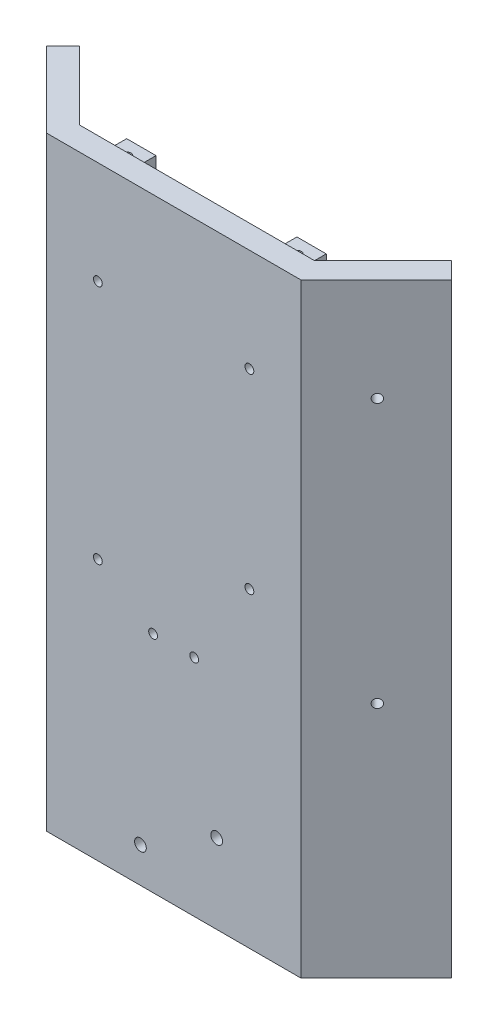
ISO-10303-21;
HEADER;
FILE_DESCRIPTION(('STEP AP214'),'2;1');
FILE_NAME('part.step','',(''),(''),'','','');
FILE_SCHEMA(('AUTOMOTIVE_DESIGN { 1 0 10303 214 1 1 1 1 }'));
ENDSEC;
DATA;
#1=APPLICATION_CONTEXT('core data for automotive mechanical design processes');
#2=APPLICATION_PROTOCOL_DEFINITION('international standard','automotive_design',2000,#1);
#3=PRODUCT_CONTEXT('',#1,'mechanical');
#4=PRODUCT('Part','Part','',(#3));
#5=PRODUCT_RELATED_PRODUCT_CATEGORY('part','',(#4));
#6=PRODUCT_DEFINITION_FORMATION('','',#4);
#7=PRODUCT_DEFINITION_CONTEXT('part definition',#1,'design');
#8=PRODUCT_DEFINITION('design','',#6,#7);
#9=PRODUCT_DEFINITION_SHAPE('','',#8);
#10=(LENGTH_UNIT() NAMED_UNIT(*) SI_UNIT(.MILLI.,.METRE.));
#11=(NAMED_UNIT(*) PLANE_ANGLE_UNIT() SI_UNIT($,.RADIAN.));
#12=(NAMED_UNIT(*) SI_UNIT($,.STERADIAN.) SOLID_ANGLE_UNIT());
#13=UNCERTAINTY_MEASURE_WITH_UNIT(LENGTH_MEASURE(1.E-05),#10,'distance_accuracy_value','');
#14=(GEOMETRIC_REPRESENTATION_CONTEXT(3) GLOBAL_UNCERTAINTY_ASSIGNED_CONTEXT((#13)) GLOBAL_UNIT_ASSIGNED_CONTEXT((#10,
#11,#12)) REPRESENTATION_CONTEXT('',''));
#15=CARTESIAN_POINT('',(0.,0.,0.));
#16=DIRECTION('',(0.,0.,1.));
#17=DIRECTION('',(1.,0.,0.));
#18=AXIS2_PLACEMENT_3D('',#15,#16,#17);
#19=CARTESIAN_POINT('',(-40.,206.,0.));
#20=DIRECTION('',(0.,0.,1.));
#21=DIRECTION('',(1.,0.,0.));
#22=AXIS2_PLACEMENT_3D('',#19,#20,#21);
#23=PLANE('',#22);
#24=CARTESIAN_POINT('',(-25.8137084989847,89.,0.));
#25=DIRECTION('',(0.,0.,1.));
#26=DIRECTION('',(1.,0.,0.));
#27=AXIS2_PLACEMENT_3D('',#24,#25,#26);
#28=CIRCLE('',#27,1.50000000000001);
#29=CARTESIAN_POINT('',(-24.3137084989847,89.,0.));
#30=VERTEX_POINT('',#29);
#31=EDGE_CURVE('E453',#30,#30,#28,.F.);
#32=ORIENTED_EDGE('',*,*,#31,.F.);
#33=EDGE_LOOP('',(#32));
#34=FACE_BOUND('',#33,.T.);
#35=CARTESIAN_POINT('',(25.8137084989848,106.,0.));
#36=DIRECTION('',(0.,0.,1.));
#37=DIRECTION('',(1.,0.,0.));
#38=AXIS2_PLACEMENT_3D('',#35,#36,#37);
#39=CIRCLE('',#38,1.5);
#40=CARTESIAN_POINT('',(27.3137084989848,106.,0.));
#41=VERTEX_POINT('',#40);
#42=EDGE_CURVE('E446',#41,#41,#39,.F.);
#43=ORIENTED_EDGE('',*,*,#42,.F.);
#44=EDGE_LOOP('',(#43));
#45=FACE_BOUND('',#44,.T.);
#46=CARTESIAN_POINT('',(-25.8137084989847,171.,0.));
#47=DIRECTION('',(0.,0.,1.));
#48=DIRECTION('',(1.,0.,0.));
#49=AXIS2_PLACEMENT_3D('',#46,#47,#48);
#50=CIRCLE('',#49,1.5);
#51=CARTESIAN_POINT('',(-24.3137084989847,171.,0.));
#52=VERTEX_POINT('',#51);
#53=EDGE_CURVE('E445',#52,#52,#50,.F.);
#54=ORIENTED_EDGE('',*,*,#53,.F.);
#55=EDGE_LOOP('',(#54));
#56=FACE_BOUND('',#55,.T.);
#57=CARTESIAN_POINT('',(25.8137084989848,171.,0.));
#58=DIRECTION('',(0.,0.,1.));
#59=DIRECTION('',(1.,0.,0.));
#60=AXIS2_PLACEMENT_3D('',#57,#58,#59);
#61=CIRCLE('',#60,1.50000000000001);
#62=CARTESIAN_POINT('',(27.3137084989848,171.,0.));
#63=VERTEX_POINT('',#62);
#64=EDGE_CURVE('E462',#63,#63,#61,.F.);
#65=ORIENTED_EDGE('',*,*,#64,.F.);
#66=EDGE_LOOP('',(#65));
#67=FACE_BOUND('',#66,.T.);
#68=CARTESIAN_POINT('',(-6.99999999999999,76.404082057735,0.));
#69=DIRECTION('',(0.,0.,1.));
#70=DIRECTION('',(1.,0.,0.));
#71=AXIS2_PLACEMENT_3D('',#68,#69,#70);
#72=CIRCLE('',#71,1.5);
#73=CARTESIAN_POINT('',(-5.49999999999999,76.404082057735,0.));
#74=VERTEX_POINT('',#73);
#75=EDGE_CURVE('E469',#74,#74,#72,.F.);
#76=ORIENTED_EDGE('',*,*,#75,.F.);
#77=EDGE_LOOP('',(#76));
#78=FACE_BOUND('',#77,.T.);
#79=CARTESIAN_POINT('',(7.00000000000001,76.404082057735,0.));
#80=DIRECTION('',(0.,0.,1.));
#81=DIRECTION('',(1.,0.,0.));
#82=AXIS2_PLACEMENT_3D('',#79,#80,#81);
#83=CIRCLE('',#82,1.5);
#84=CARTESIAN_POINT('',(8.50000000000002,76.404082057735,0.));
#85=VERTEX_POINT('',#84);
#86=EDGE_CURVE('E470',#85,#85,#83,.F.);
#87=ORIENTED_EDGE('',*,*,#86,.F.);
#88=EDGE_LOOP('',(#87));
#89=FACE_BOUND('',#88,.T.);
#90=CARTESIAN_POINT('',(-11.3137084989847,12.,0.));
#91=DIRECTION('',(0.,0.,1.));
#92=DIRECTION('',(1.,0.,0.));
#93=AXIS2_PLACEMENT_3D('',#90,#91,#92);
#94=CIRCLE('',#93,1.99999999999999);
#95=CARTESIAN_POINT('',(-9.31370849898474,12.,0.));
#96=VERTEX_POINT('',#95);
#97=EDGE_CURVE('E481',#96,#96,#94,.F.);
#98=ORIENTED_EDGE('',*,*,#97,.F.);
#99=EDGE_LOOP('',(#98));
#100=FACE_BOUND('',#99,.T.);
#101=CARTESIAN_POINT('',(14.6670536145485,26.9999999999999,0.));
#102=DIRECTION('',(0.,0.,1.));
#103=DIRECTION('',(1.,0.,0.));
#104=AXIS2_PLACEMENT_3D('',#101,#102,#103);
#105=CIRCLE('',#104,2.);
#106=CARTESIAN_POINT('',(16.6670536145485,26.9999999999999,0.));
#107=VERTEX_POINT('',#106);
#108=EDGE_CURVE('E482',#107,#107,#105,.F.);
#109=ORIENTED_EDGE('',*,*,#108,.F.);
#110=EDGE_LOOP('',(#109));
#111=FACE_BOUND('',#110,.T.);
#112=DIRECTION('',(0.,1.,0.));
#113=VECTOR('',#112,1.);
#114=CARTESIAN_POINT('',(24.,200.,0.));
#115=LINE('',#114,#113);
#116=CARTESIAN_POINT('',(24.,194.,0.));
#117=VERTEX_POINT('',#116);
#118=CARTESIAN_POINT('',(24.,200.,0.));
#119=VERTEX_POINT('',#118);
#120=EDGE_CURVE('E166',#117,#119,#115,.T.);
#121=ORIENTED_EDGE('',*,*,#120,.F.);
#122=DIRECTION('',(-1.,0.,0.));
#123=VECTOR('',#122,1.);
#124=CARTESIAN_POINT('',(34.,194.,0.));
#125=LINE('',#124,#123);
#126=CARTESIAN_POINT('',(34.,194.,0.));
#127=VERTEX_POINT('',#126);
#128=EDGE_CURVE('E179',#127,#117,#125,.T.);
#129=ORIENTED_EDGE('',*,*,#128,.F.);
#130=DIRECTION('',(0.,-1.,0.));
#131=VECTOR('',#130,1.);
#132=CARTESIAN_POINT('',(34.,200.,0.));
#133=LINE('',#132,#131);
#134=CARTESIAN_POINT('',(34.,200.,0.));
#135=VERTEX_POINT('',#134);
#136=EDGE_CURVE('E188',#135,#127,#133,.T.);
#137=ORIENTED_EDGE('',*,*,#136,.F.);
#138=DIRECTION('',(1.,0.,0.));
#139=VECTOR('',#138,1.);
#140=CARTESIAN_POINT('',(34.,200.,0.));
#141=LINE('',#140,#139);
#142=EDGE_CURVE('E169',#119,#135,#141,.T.);
#143=ORIENTED_EDGE('',*,*,#142,.F.);
#144=EDGE_LOOP('',(#121,#129,#137,#143));
#145=FACE_BOUND('',#144,.T.);
#146=DIRECTION('',(-1.,0.,0.));
#147=VECTOR('',#146,1.);
#148=CARTESIAN_POINT('',(-40.,0.,0.));
#149=LINE('',#148,#147);
#150=CARTESIAN_POINT('',(40.,0.,0.));
#151=VERTEX_POINT('',#150);
#152=CARTESIAN_POINT('',(-40.,0.,0.));
#153=VERTEX_POINT('',#152);
#154=EDGE_CURVE('E209',#151,#153,#149,.T.);
#155=ORIENTED_EDGE('',*,*,#154,.T.);
#156=DIRECTION('',(0.,-1.,0.));
#157=VECTOR('',#156,1.);
#158=CARTESIAN_POINT('',(-40.,206.,0.));
#159=LINE('',#158,#157);
#160=CARTESIAN_POINT('',(-40.,206.,0.));
#161=VERTEX_POINT('',#160);
#162=EDGE_CURVE('E223',#161,#153,#159,.T.);
#163=ORIENTED_EDGE('',*,*,#162,.F.);
#164=DIRECTION('',(-1.,0.,0.));
#165=VECTOR('',#164,1.);
#166=CARTESIAN_POINT('',(-40.,206.,0.));
#167=LINE('',#166,#165);
#168=CARTESIAN_POINT('',(40.,206.,0.));
#169=VERTEX_POINT('',#168);
#170=EDGE_CURVE('E221',#169,#161,#167,.T.);
#171=ORIENTED_EDGE('',*,*,#170,.F.);
#172=DIRECTION('',(0.,-1.,0.));
#173=VECTOR('',#172,1.);
#174=CARTESIAN_POINT('',(40.,206.,0.));
#175=LINE('',#174,#173);
#176=EDGE_CURVE('E241',#169,#151,#175,.T.);
#177=ORIENTED_EDGE('',*,*,#176,.T.);
#178=EDGE_LOOP('',(#155,#163,#171,#177));
#179=FACE_BOUND('',#178,.T.);
#180=DIRECTION('',(0.,1.,0.));
#181=VECTOR('',#180,1.);
#182=CARTESIAN_POINT('',(-34.,200.,0.));
#183=LINE('',#182,#181);
#184=CARTESIAN_POINT('',(-34.,194.,0.));
#185=VERTEX_POINT('',#184);
#186=CARTESIAN_POINT('',(-34.,200.,0.));
#187=VERTEX_POINT('',#186);
#188=EDGE_CURVE('E165',#185,#187,#183,.T.);
#189=ORIENTED_EDGE('',*,*,#188,.F.);
#190=DIRECTION('',(-1.,0.,0.));
#191=VECTOR('',#190,1.);
#192=CARTESIAN_POINT('',(-24.,194.,0.));
#193=LINE('',#192,#191);
#194=CARTESIAN_POINT('',(-24.,194.,0.));
#195=VERTEX_POINT('',#194);
#196=EDGE_CURVE('E162',#195,#185,#193,.T.);
#197=ORIENTED_EDGE('',*,*,#196,.F.);
#198=DIRECTION('',(0.,-1.,0.));
#199=VECTOR('',#198,1.);
#200=CARTESIAN_POINT('',(-24.,200.,0.));
#201=LINE('',#200,#199);
#202=CARTESIAN_POINT('',(-24.,200.,0.));
#203=VERTEX_POINT('',#202);
#204=EDGE_CURVE('E52',#203,#195,#201,.T.);
#205=ORIENTED_EDGE('',*,*,#204,.F.);
#206=DIRECTION('',(1.,0.,0.));
#207=VECTOR('',#206,1.);
#208=CARTESIAN_POINT('',(-24.,200.,0.));
#209=LINE('',#208,#207);
#210=EDGE_CURVE('E47',#187,#203,#209,.T.);
#211=ORIENTED_EDGE('',*,*,#210,.F.);
#212=EDGE_LOOP('',(#189,#197,#205,#211));
#213=FACE_BOUND('',#212,.T.);
#214=ADVANCED_FACE('F32',(#34,#45,#56,#67,#78,#89,#100,#111,#145,#179,#213),#23,.F.);
#215=CARTESIAN_POINT('',(-40.,206.,0.));
#216=DIRECTION('',(-0.707106781186544,0.,0.707106781186551));
#217=DIRECTION('',(0.707106781186551,0.,0.707106781186544));
#218=AXIS2_PLACEMENT_3D('',#215,#216,#217);
#219=PLANE('',#218);
#220=CARTESIAN_POINT('',(-48.5559920523573,171.,-8.55599205235717));
#221=DIRECTION('',(-0.707106781186544,0.,0.707106781186551));
#222=DIRECTION('',(0.707106781186551,0.,0.707106781186544));
#223=AXIS2_PLACEMENT_3D('',#220,#221,#222);
#224=CIRCLE('',#223,1.5);
#225=CARTESIAN_POINT('',(-47.4953318805774,171.,-7.49533188057736));
#226=VERTEX_POINT('',#225);
#227=EDGE_CURVE('E419',#226,#226,#224,.F.);
#228=ORIENTED_EDGE('',*,*,#227,.F.);
#229=EDGE_LOOP('',(#228));
#230=FACE_BOUND('',#229,.T.);
#231=CARTESIAN_POINT('',(-48.5559920523573,76.,-8.55599205235717));
#232=DIRECTION('',(-0.707106781186544,0.,0.707106781186551));
#233=DIRECTION('',(0.707106781186551,0.,0.707106781186544));
#234=AXIS2_PLACEMENT_3D('',#231,#232,#233);
#235=CIRCLE('',#234,1.5);
#236=CARTESIAN_POINT('',(-47.4953318805774,76.,-7.49533188057736));
#237=VERTEX_POINT('',#236);
#238=EDGE_CURVE('E425',#237,#237,#235,.F.);
#239=ORIENTED_EDGE('',*,*,#238,.F.);
#240=EDGE_LOOP('',(#239));
#241=FACE_BOUND('',#240,.T.);
#242=DIRECTION('',(-0.707106781186551,0.,-0.707106781186544));
#243=VECTOR('',#242,1.);
#244=CARTESIAN_POINT('',(-40.,0.,0.));
#245=LINE('',#244,#243);
#246=CARTESIAN_POINT('',(-63.3345237791562,0.,-23.334523779156));
#247=VERTEX_POINT('',#246);
#248=EDGE_CURVE('E204',#153,#247,#245,.T.);
#249=ORIENTED_EDGE('',*,*,#248,.T.);
#250=DIRECTION('',(0.,-1.,0.));
#251=VECTOR('',#250,1.);
#252=CARTESIAN_POINT('',(-63.3345237791562,206.,-23.334523779156));
#253=LINE('',#252,#251);
#254=CARTESIAN_POINT('',(-63.3345237791562,206.,-23.334523779156));
#255=VERTEX_POINT('',#254);
#256=EDGE_CURVE('E11',#255,#247,#253,.T.);
#257=ORIENTED_EDGE('',*,*,#256,.F.);
#258=DIRECTION('',(-0.707106781186551,0.,-0.707106781186544));
#259=VECTOR('',#258,1.);
#260=CARTESIAN_POINT('',(-40.,206.,0.));
#261=LINE('',#260,#259);
#262=EDGE_CURVE('E205',#161,#255,#261,.T.);
#263=ORIENTED_EDGE('',*,*,#262,.F.);
#264=ORIENTED_EDGE('',*,*,#162,.T.);
#265=EDGE_LOOP('',(#249,#257,#263,#264));
#266=FACE_BOUND('',#265,.T.);
#267=ADVANCED_FACE('F34',(#230,#241,#266),#219,.F.);
#268=CARTESIAN_POINT('',(-68.9913780286485,206.,-17.6776695296635));
#269=DIRECTION('',(0.707106781186551,0.,0.707106781186544));
#270=DIRECTION('',(0.707106781186544,0.,-0.707106781186551));
#271=AXIS2_PLACEMENT_3D('',#268,#269,#270);
#272=PLANE('',#271);
#273=DIRECTION('',(-0.707106781186544,0.,0.707106781186551));
#274=VECTOR('',#273,1.);
#275=CARTESIAN_POINT('',(-68.9913780286485,0.,-17.6776695296635));
#276=LINE('',#275,#274);
#277=CARTESIAN_POINT('',(-68.9913780286485,0.,-17.6776695296635));
#278=VERTEX_POINT('',#277);
#279=EDGE_CURVE('E226',#247,#278,#276,.T.);
#280=ORIENTED_EDGE('',*,*,#279,.T.);
#281=DIRECTION('',(0.,-1.,0.));
#282=VECTOR('',#281,1.);
#283=CARTESIAN_POINT('',(-68.9913780286485,206.,-17.6776695296635));
#284=LINE('',#283,#282);
#285=CARTESIAN_POINT('',(-68.9913780286485,206.,-17.6776695296635));
#286=VERTEX_POINT('',#285);
#287=EDGE_CURVE('E40',#286,#278,#284,.T.);
#288=ORIENTED_EDGE('',*,*,#287,.F.);
#289=DIRECTION('',(-0.707106781186544,0.,0.707106781186551));
#290=VECTOR('',#289,1.);
#291=CARTESIAN_POINT('',(-68.9913780286485,206.,-17.6776695296635));
#292=LINE('',#291,#290);
#293=EDGE_CURVE('E208',#255,#286,#292,.T.);
#294=ORIENTED_EDGE('',*,*,#293,.F.);
#295=ORIENTED_EDGE('',*,*,#256,.T.);
#296=EDGE_LOOP('',(#280,#288,#294,#295));
#297=FACE_BOUND('',#296,.T.);
#298=ADVANCED_FACE('F283',(#297),#272,.F.);
#299=CARTESIAN_POINT('',(-43.3137084989847,206.,8.));
#300=DIRECTION('',(0.707106781186544,0.,-0.707106781186551));
#301=DIRECTION('',(-0.707106781186551,0.,-0.707106781186544));
#302=AXIS2_PLACEMENT_3D('',#299,#300,#301);
#303=PLANE('',#302);
#304=CARTESIAN_POINT('',(-54.2128463018496,171.,-2.89913780286477));
#305=DIRECTION('',(-0.707106781186544,0.,0.707106781186551));
#306=DIRECTION('',(0.707106781186551,0.,0.707106781186544));
#307=AXIS2_PLACEMENT_3D('',#304,#305,#306);
#308=CIRCLE('',#307,1.5);
#309=CARTESIAN_POINT('',(-53.1521861300698,171.,-1.83847763108495));
#310=VERTEX_POINT('',#309);
#311=EDGE_CURVE('E416',#310,#310,#308,.T.);
#312=ORIENTED_EDGE('',*,*,#311,.F.);
#313=EDGE_LOOP('',(#312));
#314=FACE_BOUND('',#313,.T.);
#315=CARTESIAN_POINT('',(-54.2128463018496,76.,-2.89913780286477));
#316=DIRECTION('',(-0.707106781186544,0.,0.707106781186551));
#317=DIRECTION('',(0.707106781186551,0.,0.707106781186544));
#318=AXIS2_PLACEMENT_3D('',#315,#316,#317);
#319=CIRCLE('',#318,1.5);
#320=CARTESIAN_POINT('',(-53.1521861300698,76.,-1.83847763108495));
#321=VERTEX_POINT('',#320);
#322=EDGE_CURVE('E428',#321,#321,#319,.T.);
#323=ORIENTED_EDGE('',*,*,#322,.F.);
#324=EDGE_LOOP('',(#323));
#325=FACE_BOUND('',#324,.T.);
#326=DIRECTION('',(0.707106781186551,0.,0.707106781186544));
#327=VECTOR('',#326,1.);
#328=CARTESIAN_POINT('',(-43.3137084989847,0.,8.));
#329=LINE('',#328,#327);
#330=CARTESIAN_POINT('',(-43.3137084989847,0.,8.));
#331=VERTEX_POINT('',#330);
#332=EDGE_CURVE('E228',#278,#331,#329,.T.);
#333=ORIENTED_EDGE('',*,*,#332,.T.);
#334=DIRECTION('',(0.,-1.,0.));
#335=VECTOR('',#334,1.);
#336=CARTESIAN_POINT('',(-43.3137084989847,206.,8.));
#337=LINE('',#336,#335);
#338=CARTESIAN_POINT('',(-43.3137084989847,206.,8.));
#339=VERTEX_POINT('',#338);
#340=EDGE_CURVE('E253',#339,#331,#337,.T.);
#341=ORIENTED_EDGE('',*,*,#340,.F.);
#342=DIRECTION('',(0.707106781186551,0.,0.707106781186544));
#343=VECTOR('',#342,1.);
#344=CARTESIAN_POINT('',(-43.3137084989847,206.,8.));
#345=LINE('',#344,#343);
#346=EDGE_CURVE('E211',#286,#339,#345,.T.);
#347=ORIENTED_EDGE('',*,*,#346,.F.);
#348=ORIENTED_EDGE('',*,*,#287,.T.);
#349=EDGE_LOOP('',(#333,#341,#347,#348));
#350=FACE_BOUND('',#349,.T.);
#351=ADVANCED_FACE('F260',(#314,#325,#350),#303,.F.);
#352=CARTESIAN_POINT('',(-43.3137084989847,206.,8.));
#353=DIRECTION('',(0.,0.,-1.));
#354=DIRECTION('',(-1.,0.,0.));
#355=AXIS2_PLACEMENT_3D('',#352,#353,#354);
#356=PLANE('',#355);
#357=CARTESIAN_POINT('',(-25.8137084989847,89.,8.));
#358=DIRECTION('',(0.,0.,1.));
#359=DIRECTION('',(1.,0.,0.));
#360=AXIS2_PLACEMENT_3D('',#357,#358,#359);
#361=CIRCLE('',#360,1.50000000000001);
#362=CARTESIAN_POINT('',(-24.3137084989847,89.,8.));
#363=VERTEX_POINT('',#362);
#364=EDGE_CURVE('E441',#363,#363,#361,.T.);
#365=ORIENTED_EDGE('',*,*,#364,.F.);
#366=EDGE_LOOP('',(#365));
#367=FACE_BOUND('',#366,.T.);
#368=CARTESIAN_POINT('',(25.8137084989848,106.,8.));
#369=DIRECTION('',(0.,0.,1.));
#370=DIRECTION('',(1.,0.,0.));
#371=AXIS2_PLACEMENT_3D('',#368,#369,#370);
#372=CIRCLE('',#371,1.5);
#373=CARTESIAN_POINT('',(27.3137084989848,106.,8.));
#374=VERTEX_POINT('',#373);
#375=EDGE_CURVE('E450',#374,#374,#372,.T.);
#376=ORIENTED_EDGE('',*,*,#375,.F.);
#377=EDGE_LOOP('',(#376));
#378=FACE_BOUND('',#377,.T.);
#379=CARTESIAN_POINT('',(-25.8137084989847,171.,8.));
#380=DIRECTION('',(0.,0.,1.));
#381=DIRECTION('',(1.,0.,0.));
#382=AXIS2_PLACEMENT_3D('',#379,#380,#381);
#383=CIRCLE('',#382,1.5);
#384=CARTESIAN_POINT('',(-24.3137084989847,171.,8.));
#385=VERTEX_POINT('',#384);
#386=EDGE_CURVE('E442',#385,#385,#383,.T.);
#387=ORIENTED_EDGE('',*,*,#386,.F.);
#388=EDGE_LOOP('',(#387));
#389=FACE_BOUND('',#388,.T.);
#390=CARTESIAN_POINT('',(25.8137084989848,171.,8.));
#391=DIRECTION('',(0.,0.,1.));
#392=DIRECTION('',(1.,0.,0.));
#393=AXIS2_PLACEMENT_3D('',#390,#391,#392);
#394=CIRCLE('',#393,1.50000000000001);
#395=CARTESIAN_POINT('',(27.3137084989848,171.,8.));
#396=VERTEX_POINT('',#395);
#397=EDGE_CURVE('E449',#396,#396,#394,.T.);
#398=ORIENTED_EDGE('',*,*,#397,.F.);
#399=EDGE_LOOP('',(#398));
#400=FACE_BOUND('',#399,.T.);
#401=CARTESIAN_POINT('',(-6.99999999999999,76.404082057735,8.));
#402=DIRECTION('',(0.,0.,1.));
#403=DIRECTION('',(1.,0.,0.));
#404=AXIS2_PLACEMENT_3D('',#401,#402,#403);
#405=CIRCLE('',#404,1.5);
#406=CARTESIAN_POINT('',(-5.49999999999999,76.404082057735,8.));
#407=VERTEX_POINT('',#406);
#408=EDGE_CURVE('E466',#407,#407,#405,.T.);
#409=ORIENTED_EDGE('',*,*,#408,.F.);
#410=EDGE_LOOP('',(#409));
#411=FACE_BOUND('',#410,.T.);
#412=CARTESIAN_POINT('',(7.00000000000001,76.404082057735,8.));
#413=DIRECTION('',(0.,0.,1.));
#414=DIRECTION('',(1.,0.,0.));
#415=AXIS2_PLACEMENT_3D('',#412,#413,#414);
#416=CIRCLE('',#415,1.5);
#417=CARTESIAN_POINT('',(8.50000000000002,76.404082057735,8.));
#418=VERTEX_POINT('',#417);
#419=EDGE_CURVE('E465',#418,#418,#416,.T.);
#420=ORIENTED_EDGE('',*,*,#419,.F.);
#421=EDGE_LOOP('',(#420));
#422=FACE_BOUND('',#421,.T.);
#423=CARTESIAN_POINT('',(-11.3137084989847,12.,8.));
#424=DIRECTION('',(0.,0.,1.));
#425=DIRECTION('',(1.,0.,0.));
#426=AXIS2_PLACEMENT_3D('',#423,#424,#425);
#427=CIRCLE('',#426,1.99999999999999);
#428=CARTESIAN_POINT('',(-9.31370849898474,12.,8.));
#429=VERTEX_POINT('',#428);
#430=EDGE_CURVE('E478',#429,#429,#427,.T.);
#431=ORIENTED_EDGE('',*,*,#430,.F.);
#432=EDGE_LOOP('',(#431));
#433=FACE_BOUND('',#432,.T.);
#434=CARTESIAN_POINT('',(14.6670536145485,26.9999999999999,8.));
#435=DIRECTION('',(0.,0.,1.));
#436=DIRECTION('',(1.,0.,0.));
#437=AXIS2_PLACEMENT_3D('',#434,#435,#436);
#438=CIRCLE('',#437,2.);
#439=CARTESIAN_POINT('',(16.6670536145485,26.9999999999999,8.));
#440=VERTEX_POINT('',#439);
#441=EDGE_CURVE('E473',#440,#440,#438,.T.);
#442=ORIENTED_EDGE('',*,*,#441,.F.);
#443=EDGE_LOOP('',(#442));
#444=FACE_BOUND('',#443,.T.);
#445=DIRECTION('',(1.,0.,0.));
#446=VECTOR('',#445,1.);
#447=CARTESIAN_POINT('',(-43.3137084989847,0.,8.));
#448=LINE('',#447,#446);
#449=CARTESIAN_POINT('',(43.3137084989848,0.,8.));
#450=VERTEX_POINT('',#449);
#451=EDGE_CURVE('E230',#331,#450,#448,.T.);
#452=ORIENTED_EDGE('',*,*,#451,.T.);
#453=DIRECTION('',(0.,-1.,0.));
#454=VECTOR('',#453,1.);
#455=CARTESIAN_POINT('',(43.3137084989848,206.,8.));
#456=LINE('',#455,#454);
#457=CARTESIAN_POINT('',(43.3137084989848,206.,8.));
#458=VERTEX_POINT('',#457);
#459=EDGE_CURVE('E250',#458,#450,#456,.T.);
#460=ORIENTED_EDGE('',*,*,#459,.F.);
#461=DIRECTION('',(1.,0.,0.));
#462=VECTOR('',#461,1.);
#463=CARTESIAN_POINT('',(-43.3137084989847,206.,8.));
#464=LINE('',#463,#462);
#465=EDGE_CURVE('E213',#339,#458,#464,.T.);
#466=ORIENTED_EDGE('',*,*,#465,.F.);
#467=ORIENTED_EDGE('',*,*,#340,.T.);
#468=EDGE_LOOP('',(#452,#460,#466,#467));
#469=FACE_BOUND('',#468,.T.);
#470=ADVANCED_FACE('F271',(#367,#378,#389,#400,#411,#422,#433,#444,#469),#356,.F.);
#471=CARTESIAN_POINT('',(43.3137084989848,206.,8.));
#472=DIRECTION('',(-0.707106781186549,0.,-0.707106781186546));
#473=DIRECTION('',(-0.707106781186546,0.,0.707106781186549));
#474=AXIS2_PLACEMENT_3D('',#471,#472,#473);
#475=PLANE('',#474);
#476=CARTESIAN_POINT('',(56.3527575440647,171.,-5.03904904507995));
#477=DIRECTION('',(-0.707106781186549,0.,-0.707106781186546));
#478=DIRECTION('',(-0.707106781186546,0.,0.707106781186549));
#479=AXIS2_PLACEMENT_3D('',#476,#477,#478);
#480=CIRCLE('',#479,1.5);
#481=CARTESIAN_POINT('',(55.2920973722849,171.,-3.97838887330013));
#482=VERTEX_POINT('',#481);
#483=EDGE_CURVE('E438',#482,#482,#480,.F.);
#484=ORIENTED_EDGE('',*,*,#483,.F.);
#485=EDGE_LOOP('',(#484));
#486=FACE_BOUND('',#485,.T.);
#487=CARTESIAN_POINT('',(56.3527575440647,81.,-5.03904904507995));
#488=DIRECTION('',(-0.707106781186549,0.,-0.707106781186546));
#489=DIRECTION('',(-0.707106781186546,0.,0.707106781186549));
#490=AXIS2_PLACEMENT_3D('',#487,#488,#489);
#491=CIRCLE('',#490,1.5);
#492=CARTESIAN_POINT('',(55.2920973722849,81.,-3.97838887330013));
#493=VERTEX_POINT('',#492);
#494=EDGE_CURVE('E434',#493,#493,#491,.F.);
#495=ORIENTED_EDGE('',*,*,#494,.F.);
#496=EDGE_LOOP('',(#495));
#497=FACE_BOUND('',#496,.T.);
#498=DIRECTION('',(0.707106781186546,0.,-0.707106781186549));
#499=VECTOR('',#498,1.);
#500=CARTESIAN_POINT('',(43.3137084989848,0.,8.));
#501=LINE('',#500,#499);
#502=CARTESIAN_POINT('',(68.9913780286484,0.,-17.6776695296637));
#503=VERTEX_POINT('',#502);
#504=EDGE_CURVE('E232',#450,#503,#501,.T.);
#505=ORIENTED_EDGE('',*,*,#504,.T.);
#506=DIRECTION('',(0.,-1.,0.));
#507=VECTOR('',#506,1.);
#508=CARTESIAN_POINT('',(68.9913780286484,206.,-17.6776695296637));
#509=LINE('',#508,#507);
#510=CARTESIAN_POINT('',(68.9913780286484,206.,-17.6776695296637));
#511=VERTEX_POINT('',#510);
#512=EDGE_CURVE('E247',#511,#503,#509,.T.);
#513=ORIENTED_EDGE('',*,*,#512,.F.);
#514=DIRECTION('',(0.707106781186546,0.,-0.707106781186549));
#515=VECTOR('',#514,1.);
#516=CARTESIAN_POINT('',(43.3137084989848,206.,8.));
#517=LINE('',#516,#515);
#518=EDGE_CURVE('E215',#458,#511,#517,.T.);
#519=ORIENTED_EDGE('',*,*,#518,.F.);
#520=ORIENTED_EDGE('',*,*,#459,.T.);
#521=EDGE_LOOP('',(#505,#513,#519,#520));
#522=FACE_BOUND('',#521,.T.);
#523=ADVANCED_FACE('F275',(#486,#497,#522),#475,.F.);
#524=CARTESIAN_POINT('',(68.9913780286484,206.,-17.6776695296637));
#525=DIRECTION('',(-0.707106781186546,0.,0.707106781186549));
#526=DIRECTION('',(0.707106781186549,0.,0.707106781186546));
#527=AXIS2_PLACEMENT_3D('',#524,#525,#526);
#528=PLANE('',#527);
#529=DIRECTION('',(-0.707106781186549,0.,-0.707106781186546));
#530=VECTOR('',#529,1.);
#531=CARTESIAN_POINT('',(68.9913780286484,0.,-17.6776695296637));
#532=LINE('',#531,#530);
#533=CARTESIAN_POINT('',(63.334523779156,0.,-23.3345237791561));
#534=VERTEX_POINT('',#533);
#535=EDGE_CURVE('E234',#503,#534,#532,.T.);
#536=ORIENTED_EDGE('',*,*,#535,.T.);
#537=DIRECTION('',(0.,-1.,0.));
#538=VECTOR('',#537,1.);
#539=CARTESIAN_POINT('',(63.334523779156,206.,-23.3345237791561));
#540=LINE('',#539,#538);
#541=CARTESIAN_POINT('',(63.334523779156,206.,-23.3345237791561));
#542=VERTEX_POINT('',#541);
#543=EDGE_CURVE('E244',#542,#534,#540,.T.);
#544=ORIENTED_EDGE('',*,*,#543,.F.);
#545=DIRECTION('',(-0.707106781186549,0.,-0.707106781186546));
#546=VECTOR('',#545,1.);
#547=CARTESIAN_POINT('',(68.9913780286484,206.,-17.6776695296637));
#548=LINE('',#547,#546);
#549=EDGE_CURVE('E217',#511,#542,#548,.T.);
#550=ORIENTED_EDGE('',*,*,#549,.F.);
#551=ORIENTED_EDGE('',*,*,#512,.T.);
#552=EDGE_LOOP('',(#536,#544,#550,#551));
#553=FACE_BOUND('',#552,.T.);
#554=ADVANCED_FACE('F295',(#553),#528,.F.);
#555=CARTESIAN_POINT('',(40.,206.,0.));
#556=DIRECTION('',(0.707106781186549,0.,0.707106781186546));
#557=DIRECTION('',(0.707106781186546,0.,-0.707106781186549));
#558=AXIS2_PLACEMENT_3D('',#555,#556,#557);
#559=PLANE('',#558);
#560=CARTESIAN_POINT('',(50.6959032945723,171.,-10.6959032945723));
#561=DIRECTION('',(0.707106781186549,0.,0.707106781186546));
#562=DIRECTION('',(0.707106781186546,0.,-0.707106781186549));
#563=AXIS2_PLACEMENT_3D('',#560,#561,#562);
#564=CIRCLE('',#563,1.5);
#565=CARTESIAN_POINT('',(51.7565634663521,171.,-11.7565634663522));
#566=VERTEX_POINT('',#565);
#567=EDGE_CURVE('E423',#566,#566,#564,.F.);
#568=ORIENTED_EDGE('',*,*,#567,.F.);
#569=EDGE_LOOP('',(#568));
#570=FACE_BOUND('',#569,.T.);
#571=CARTESIAN_POINT('',(50.6959032945723,81.,-10.6959032945723));
#572=DIRECTION('',(0.707106781186549,0.,0.707106781186546));
#573=DIRECTION('',(0.707106781186546,0.,-0.707106781186549));
#574=AXIS2_PLACEMENT_3D('',#571,#572,#573);
#575=CIRCLE('',#574,1.5);
#576=CARTESIAN_POINT('',(51.7565634663521,81.,-11.7565634663522));
#577=VERTEX_POINT('',#576);
#578=EDGE_CURVE('E420',#577,#577,#575,.F.);
#579=ORIENTED_EDGE('',*,*,#578,.F.);
#580=EDGE_LOOP('',(#579));
#581=FACE_BOUND('',#580,.T.);
#582=DIRECTION('',(-0.707106781186546,0.,0.707106781186549));
#583=VECTOR('',#582,1.);
#584=CARTESIAN_POINT('',(40.,0.,0.));
#585=LINE('',#584,#583);
#586=EDGE_CURVE('E236',#534,#151,#585,.T.);
#587=ORIENTED_EDGE('',*,*,#586,.T.);
#588=ORIENTED_EDGE('',*,*,#176,.F.);
#589=DIRECTION('',(-0.707106781186546,0.,0.707106781186549));
#590=VECTOR('',#589,1.);
#591=CARTESIAN_POINT('',(40.,206.,0.));
#592=LINE('',#591,#590);
#593=EDGE_CURVE('E219',#542,#169,#592,.T.);
#594=ORIENTED_EDGE('',*,*,#593,.F.);
#595=ORIENTED_EDGE('',*,*,#543,.T.);
#596=EDGE_LOOP('',(#587,#588,#594,#595));
#597=FACE_BOUND('',#596,.T.);
#598=ADVANCED_FACE('F293',(#570,#581,#597),#559,.F.);
#599=CARTESIAN_POINT('',(0.,206.,0.));
#600=DIRECTION('',(0.,-1.,0.));
#601=DIRECTION('',(0.,0.,-1.));
#602=AXIS2_PLACEMENT_3D('',#599,#600,#601);
#603=PLANE('',#602);
#604=ORIENTED_EDGE('',*,*,#262,.T.);
#605=ORIENTED_EDGE('',*,*,#293,.T.);
#606=ORIENTED_EDGE('',*,*,#346,.T.);
#607=ORIENTED_EDGE('',*,*,#465,.T.);
#608=ORIENTED_EDGE('',*,*,#518,.T.);
#609=ORIENTED_EDGE('',*,*,#549,.T.);
#610=ORIENTED_EDGE('',*,*,#593,.T.);
#611=ORIENTED_EDGE('',*,*,#170,.T.);
#612=EDGE_LOOP('',(#604,#605,#606,#607,#608,#609,#610,#611));
#613=FACE_BOUND('',#612,.T.);
#614=ADVANCED_FACE('F279',(#613),#603,.F.);
#615=CARTESIAN_POINT('',(0.,0.,0.));
#616=DIRECTION('',(0.,-1.,0.));
#617=DIRECTION('',(0.,0.,-1.));
#618=AXIS2_PLACEMENT_3D('',#615,#616,#617);
#619=PLANE('',#618);
#620=ORIENTED_EDGE('',*,*,#248,.F.);
#621=ORIENTED_EDGE('',*,*,#154,.F.);
#622=ORIENTED_EDGE('',*,*,#586,.F.);
#623=ORIENTED_EDGE('',*,*,#535,.F.);
#624=ORIENTED_EDGE('',*,*,#504,.F.);
#625=ORIENTED_EDGE('',*,*,#451,.F.);
#626=ORIENTED_EDGE('',*,*,#332,.F.);
#627=ORIENTED_EDGE('',*,*,#279,.F.);
#628=EDGE_LOOP('',(#620,#621,#622,#623,#624,#625,#626,#627));
#629=FACE_BOUND('',#628,.T.);
#630=ADVANCED_FACE('F266',(#629),#619,.T.);
#631=CARTESIAN_POINT('',(24.,200.,-10.));
#632=DIRECTION('',(1.,0.,0.));
#633=DIRECTION('',(0.,0.,-1.));
#634=AXIS2_PLACEMENT_3D('',#631,#632,#633);
#635=PLANE('',#634);
#636=ORIENTED_EDGE('',*,*,#120,.T.);
#637=DIRECTION('',(0.,0.,1.));
#638=VECTOR('',#637,1.);
#639=CARTESIAN_POINT('',(24.,200.,-10.));
#640=LINE('',#639,#638);
#641=CARTESIAN_POINT('',(24.,200.,-10.));
#642=VERTEX_POINT('',#641);
#643=EDGE_CURVE('E201',#642,#119,#640,.T.);
#644=ORIENTED_EDGE('',*,*,#643,.F.);
#645=DIRECTION('',(0.,1.,0.));
#646=VECTOR('',#645,1.);
#647=CARTESIAN_POINT('',(24.,200.,-10.));
#648=LINE('',#647,#646);
#649=CARTESIAN_POINT('',(24.,194.,-10.));
#650=VERTEX_POINT('',#649);
#651=EDGE_CURVE('E175',#650,#642,#648,.T.);
#652=ORIENTED_EDGE('',*,*,#651,.F.);
#653=DIRECTION('',(0.,0.,1.));
#654=VECTOR('',#653,1.);
#655=CARTESIAN_POINT('',(24.,194.,-10.));
#656=LINE('',#655,#654);
#657=EDGE_CURVE('E184',#650,#117,#656,.T.);
#658=ORIENTED_EDGE('',*,*,#657,.T.);
#659=EDGE_LOOP('',(#636,#644,#652,#658));
#660=FACE_BOUND('',#659,.T.);
#661=ADVANCED_FACE('F319',(#660),#635,.F.);
#662=CARTESIAN_POINT('',(34.,200.,-10.));
#663=DIRECTION('',(0.,-1.,0.));
#664=DIRECTION('',(1.,0.,0.));
#665=AXIS2_PLACEMENT_3D('',#662,#663,#664);
#666=PLANE('',#665);
#667=CARTESIAN_POINT('',(29.,200.,-5.));
#668=DIRECTION('',(0.,1.,0.));
#669=DIRECTION('',(-1.,0.,0.));
#670=AXIS2_PLACEMENT_3D('',#667,#668,#669);
#671=CIRCLE('',#670,1.50000000000001);
#672=CARTESIAN_POINT('',(27.5,200.,-5.));
#673=VERTEX_POINT('',#672);
#674=EDGE_CURVE('E485',#673,#673,#671,.T.);
#675=ORIENTED_EDGE('',*,*,#674,.F.);
#676=EDGE_LOOP('',(#675));
#677=FACE_BOUND('',#676,.T.);
#678=ORIENTED_EDGE('',*,*,#142,.T.);
#679=DIRECTION('',(0.,0.,1.));
#680=VECTOR('',#679,1.);
#681=CARTESIAN_POINT('',(34.,200.,-10.));
#682=LINE('',#681,#680);
#683=CARTESIAN_POINT('',(34.,200.,-10.));
#684=VERTEX_POINT('',#683);
#685=EDGE_CURVE('E198',#684,#135,#682,.T.);
#686=ORIENTED_EDGE('',*,*,#685,.F.);
#687=DIRECTION('',(1.,0.,0.));
#688=VECTOR('',#687,1.);
#689=CARTESIAN_POINT('',(34.,200.,-10.));
#690=LINE('',#689,#688);
#691=EDGE_CURVE('E178',#642,#684,#690,.T.);
#692=ORIENTED_EDGE('',*,*,#691,.F.);
#693=ORIENTED_EDGE('',*,*,#643,.T.);
#694=EDGE_LOOP('',(#678,#686,#692,#693));
#695=FACE_BOUND('',#694,.T.);
#696=ADVANCED_FACE('F324',(#677,#695),#666,.F.);
#697=CARTESIAN_POINT('',(34.,200.,-10.));
#698=DIRECTION('',(-1.,0.,0.));
#699=DIRECTION('',(0.,0.,1.));
#700=AXIS2_PLACEMENT_3D('',#697,#698,#699);
#701=PLANE('',#700);
#702=ORIENTED_EDGE('',*,*,#136,.T.);
#703=DIRECTION('',(0.,0.,1.));
#704=VECTOR('',#703,1.);
#705=CARTESIAN_POINT('',(34.,194.,-10.));
#706=LINE('',#705,#704);
#707=CARTESIAN_POINT('',(34.,194.,-10.));
#708=VERTEX_POINT('',#707);
#709=EDGE_CURVE('E195',#708,#127,#706,.T.);
#710=ORIENTED_EDGE('',*,*,#709,.F.);
#711=DIRECTION('',(0.,-1.,0.));
#712=VECTOR('',#711,1.);
#713=CARTESIAN_POINT('',(34.,200.,-10.));
#714=LINE('',#713,#712);
#715=EDGE_CURVE('E181',#684,#708,#714,.T.);
#716=ORIENTED_EDGE('',*,*,#715,.F.);
#717=ORIENTED_EDGE('',*,*,#685,.T.);
#718=EDGE_LOOP('',(#702,#710,#716,#717));
#719=FACE_BOUND('',#718,.T.);
#720=ADVANCED_FACE('F328',(#719),#701,.F.);
#721=CARTESIAN_POINT('',(34.,194.,-10.));
#722=DIRECTION('',(0.,1.,0.));
#723=DIRECTION('',(0.,0.,1.));
#724=AXIS2_PLACEMENT_3D('',#721,#722,#723);
#725=PLANE('',#724);
#726=CARTESIAN_POINT('',(29.,194.,-5.));
#727=DIRECTION('',(0.,1.,0.));
#728=DIRECTION('',(0.,0.,1.));
#729=AXIS2_PLACEMENT_3D('',#726,#727,#728);
#730=CIRCLE('',#729,1.50000000000001);
#731=CARTESIAN_POINT('',(29.,194.,-3.49999999999999));
#732=VERTEX_POINT('',#731);
#733=EDGE_CURVE('E494',#732,#732,#730,.F.);
#734=ORIENTED_EDGE('',*,*,#733,.F.);
#735=EDGE_LOOP('',(#734));
#736=FACE_BOUND('',#735,.T.);
#737=ORIENTED_EDGE('',*,*,#128,.T.);
#738=ORIENTED_EDGE('',*,*,#657,.F.);
#739=DIRECTION('',(-1.,0.,0.));
#740=VECTOR('',#739,1.);
#741=CARTESIAN_POINT('',(34.,194.,-10.));
#742=LINE('',#741,#740);
#743=EDGE_CURVE('E183',#708,#650,#742,.T.);
#744=ORIENTED_EDGE('',*,*,#743,.F.);
#745=ORIENTED_EDGE('',*,*,#709,.T.);
#746=EDGE_LOOP('',(#737,#738,#744,#745));
#747=FACE_BOUND('',#746,.T.);
#748=ADVANCED_FACE('F332',(#736,#747),#725,.F.);
#749=CARTESIAN_POINT('',(0.,0.,-10.));
#750=DIRECTION('',(0.,0.,-1.));
#751=DIRECTION('',(-1.,0.,0.));
#752=AXIS2_PLACEMENT_3D('',#749,#750,#751);
#753=PLANE('',#752);
#754=ORIENTED_EDGE('',*,*,#651,.T.);
#755=ORIENTED_EDGE('',*,*,#691,.T.);
#756=ORIENTED_EDGE('',*,*,#715,.T.);
#757=ORIENTED_EDGE('',*,*,#743,.T.);
#758=EDGE_LOOP('',(#754,#755,#756,#757));
#759=FACE_BOUND('',#758,.T.);
#760=ADVANCED_FACE('F336',(#759),#753,.T.);
#761=CARTESIAN_POINT('',(-34.,200.,-9.99999999999999));
#762=DIRECTION('',(1.,0.,0.));
#763=DIRECTION('',(0.,0.,-1.));
#764=AXIS2_PLACEMENT_3D('',#761,#762,#763);
#765=PLANE('',#764);
#766=ORIENTED_EDGE('',*,*,#188,.T.);
#767=DIRECTION('',(0.,0.,1.));
#768=VECTOR('',#767,1.);
#769=CARTESIAN_POINT('',(-34.,200.,-9.99999999999999));
#770=LINE('',#769,#768);
#771=CARTESIAN_POINT('',(-34.,200.,-9.99999999999999));
#772=VERTEX_POINT('',#771);
#773=EDGE_CURVE('E146',#772,#187,#770,.T.);
#774=ORIENTED_EDGE('',*,*,#773,.F.);
#775=DIRECTION('',(0.,1.,0.));
#776=VECTOR('',#775,1.);
#777=CARTESIAN_POINT('',(-34.,200.,-9.99999999999999));
#778=LINE('',#777,#776);
#779=CARTESIAN_POINT('',(-34.,194.,-9.99999999999999));
#780=VERTEX_POINT('',#779);
#781=EDGE_CURVE('E153',#780,#772,#778,.T.);
#782=ORIENTED_EDGE('',*,*,#781,.F.);
#783=DIRECTION('',(0.,0.,1.));
#784=VECTOR('',#783,1.);
#785=CARTESIAN_POINT('',(-34.,194.,-9.99999999999999));
#786=LINE('',#785,#784);
#787=EDGE_CURVE('E503',#780,#185,#786,.T.);
#788=ORIENTED_EDGE('',*,*,#787,.T.);
#789=EDGE_LOOP('',(#766,#774,#782,#788));
#790=FACE_BOUND('',#789,.T.);
#791=ADVANCED_FACE('F164',(#790),#765,.F.);
#792=CARTESIAN_POINT('',(-24.,200.,-9.99999999999999));
#793=DIRECTION('',(0.,-1.,0.));
#794=DIRECTION('',(0.,0.,-1.));
#795=AXIS2_PLACEMENT_3D('',#792,#793,#794);
#796=PLANE('',#795);
#797=CARTESIAN_POINT('',(-29.,200.,-5.));
#798=DIRECTION('',(0.,1.,0.));
#799=DIRECTION('',(-1.,0.,0.));
#800=AXIS2_PLACEMENT_3D('',#797,#798,#799);
#801=CIRCLE('',#800,1.5);
#802=CARTESIAN_POINT('',(-30.5,200.,-5.));
#803=VERTEX_POINT('',#802);
#804=EDGE_CURVE('E490',#803,#803,#801,.T.);
#805=ORIENTED_EDGE('',*,*,#804,.F.);
#806=EDGE_LOOP('',(#805));
#807=FACE_BOUND('',#806,.T.);
#808=ORIENTED_EDGE('',*,*,#210,.T.);
#809=DIRECTION('',(0.,0.,1.));
#810=VECTOR('',#809,1.);
#811=CARTESIAN_POINT('',(-24.,200.,-9.99999999999999));
#812=LINE('',#811,#810);
#813=CARTESIAN_POINT('',(-24.,200.,-9.99999999999999));
#814=VERTEX_POINT('',#813);
#815=EDGE_CURVE('E149',#814,#203,#812,.T.);
#816=ORIENTED_EDGE('',*,*,#815,.F.);
#817=DIRECTION('',(1.,0.,0.));
#818=VECTOR('',#817,1.);
#819=CARTESIAN_POINT('',(-24.,200.,-9.99999999999999));
#820=LINE('',#819,#818);
#821=EDGE_CURVE('E142',#772,#814,#820,.T.);
#822=ORIENTED_EDGE('',*,*,#821,.F.);
#823=ORIENTED_EDGE('',*,*,#773,.T.);
#824=EDGE_LOOP('',(#808,#816,#822,#823));
#825=FACE_BOUND('',#824,.T.);
#826=ADVANCED_FACE('F144',(#807,#825),#796,.F.);
#827=CARTESIAN_POINT('',(-24.,200.,-9.99999999999999));
#828=DIRECTION('',(-1.,0.,0.));
#829=DIRECTION('',(0.,-1.,0.));
#830=AXIS2_PLACEMENT_3D('',#827,#828,#829);
#831=PLANE('',#830);
#832=ORIENTED_EDGE('',*,*,#204,.T.);
#833=DIRECTION('',(0.,0.,1.));
#834=VECTOR('',#833,1.);
#835=CARTESIAN_POINT('',(-24.,194.,-9.99999999999999));
#836=LINE('',#835,#834);
#837=CARTESIAN_POINT('',(-24.,194.,-9.99999999999999));
#838=VERTEX_POINT('',#837);
#839=EDGE_CURVE('E171',#838,#195,#836,.T.);
#840=ORIENTED_EDGE('',*,*,#839,.F.);
#841=DIRECTION('',(0.,-1.,0.));
#842=VECTOR('',#841,1.);
#843=CARTESIAN_POINT('',(-24.,200.,-9.99999999999999));
#844=LINE('',#843,#842);
#845=EDGE_CURVE('E152',#814,#838,#844,.T.);
#846=ORIENTED_EDGE('',*,*,#845,.F.);
#847=ORIENTED_EDGE('',*,*,#815,.T.);
#848=EDGE_LOOP('',(#832,#840,#846,#847));
#849=FACE_BOUND('',#848,.T.);
#850=ADVANCED_FACE('F345',(#849),#831,.F.);
#851=CARTESIAN_POINT('',(-24.,194.,-9.99999999999999));
#852=DIRECTION('',(0.,1.,0.));
#853=DIRECTION('',(0.,0.,1.));
#854=AXIS2_PLACEMENT_3D('',#851,#852,#853);
#855=PLANE('',#854);
#856=CARTESIAN_POINT('',(-29.,194.,-5.));
#857=DIRECTION('',(0.,1.,0.));
#858=DIRECTION('',(0.,0.,1.));
#859=AXIS2_PLACEMENT_3D('',#856,#857,#858);
#860=CIRCLE('',#859,1.5);
#861=CARTESIAN_POINT('',(-29.,194.,-3.5));
#862=VERTEX_POINT('',#861);
#863=EDGE_CURVE('E493',#862,#862,#860,.F.);
#864=ORIENTED_EDGE('',*,*,#863,.F.);
#865=EDGE_LOOP('',(#864));
#866=FACE_BOUND('',#865,.T.);
#867=ORIENTED_EDGE('',*,*,#196,.T.);
#868=ORIENTED_EDGE('',*,*,#787,.F.);
#869=DIRECTION('',(-1.,0.,0.));
#870=VECTOR('',#869,1.);
#871=CARTESIAN_POINT('',(-24.,194.,-9.99999999999999));
#872=LINE('',#871,#870);
#873=EDGE_CURVE('E158',#838,#780,#872,.T.);
#874=ORIENTED_EDGE('',*,*,#873,.F.);
#875=ORIENTED_EDGE('',*,*,#839,.T.);
#876=EDGE_LOOP('',(#867,#868,#874,#875));
#877=FACE_BOUND('',#876,.T.);
#878=ADVANCED_FACE('F349',(#866,#877),#855,.F.);
#879=CARTESIAN_POINT('',(0.,0.,-10.));
#880=DIRECTION('',(0.,0.,-1.));
#881=DIRECTION('',(-1.,0.,0.));
#882=AXIS2_PLACEMENT_3D('',#879,#880,#881);
#883=PLANE('',#882);
#884=ORIENTED_EDGE('',*,*,#781,.T.);
#885=ORIENTED_EDGE('',*,*,#821,.T.);
#886=ORIENTED_EDGE('',*,*,#845,.T.);
#887=ORIENTED_EDGE('',*,*,#873,.T.);
#888=EDGE_LOOP('',(#884,#885,#886,#887));
#889=FACE_BOUND('',#888,.T.);
#890=ADVANCED_FACE('F156',(#889),#883,.T.);
#891=CARTESIAN_POINT('',(-29.0000000000006,-0.00100000000011202,-5.));
#892=DIRECTION('',(0.,1.,0.));
#893=DIRECTION('',(-1.,0.,0.));
#894=AXIS2_PLACEMENT_3D('',#891,#892,#893);
#895=CYLINDRICAL_SURFACE('',#894,1.5);
#896=ORIENTED_EDGE('',*,*,#804,.T.);
#897=EDGE_LOOP('',(#896));
#898=FACE_BOUND('',#897,.T.);
#899=ORIENTED_EDGE('',*,*,#863,.T.);
#900=EDGE_LOOP('',(#899));
#901=FACE_BOUND('',#900,.T.);
#902=ADVANCED_FACE('F356',(#898,#901),#895,.F.);
#903=CARTESIAN_POINT('',(28.9999999999994,-0.00100000000027856,-5.));
#904=DIRECTION('',(0.,1.,0.));
#905=DIRECTION('',(-1.,0.,0.));
#906=AXIS2_PLACEMENT_3D('',#903,#904,#905);
#907=CYLINDRICAL_SURFACE('',#906,1.50000000000001);
#908=ORIENTED_EDGE('',*,*,#674,.T.);
#909=EDGE_LOOP('',(#908));
#910=FACE_BOUND('',#909,.T.);
#911=ORIENTED_EDGE('',*,*,#733,.T.);
#912=EDGE_LOOP('',(#911));
#913=FACE_BOUND('',#912,.T.);
#914=ADVANCED_FACE('F357',(#910,#913),#907,.F.);
#915=CARTESIAN_POINT('',(14.6670536145485,26.9999999999999,-23.3355237791561));
#916=DIRECTION('',(0.,0.,1.));
#917=DIRECTION('',(1.,0.,0.));
#918=AXIS2_PLACEMENT_3D('',#915,#916,#917);
#919=CYLINDRICAL_SURFACE('',#918,2.);
#920=ORIENTED_EDGE('',*,*,#441,.T.);
#921=EDGE_LOOP('',(#920));
#922=FACE_BOUND('',#921,.T.);
#923=ORIENTED_EDGE('',*,*,#108,.T.);
#924=EDGE_LOOP('',(#923));
#925=FACE_BOUND('',#924,.T.);
#926=ADVANCED_FACE('F360',(#922,#925),#919,.F.);
#927=CARTESIAN_POINT('',(-11.3137084989847,12.,-23.3355237791561));
#928=DIRECTION('',(0.,0.,1.));
#929=DIRECTION('',(1.,0.,0.));
#930=AXIS2_PLACEMENT_3D('',#927,#928,#929);
#931=CYLINDRICAL_SURFACE('',#930,1.99999999999999);
#932=ORIENTED_EDGE('',*,*,#430,.T.);
#933=EDGE_LOOP('',(#932));
#934=FACE_BOUND('',#933,.T.);
#935=ORIENTED_EDGE('',*,*,#97,.T.);
#936=EDGE_LOOP('',(#935));
#937=FACE_BOUND('',#936,.T.);
#938=ADVANCED_FACE('F367',(#934,#937),#931,.F.);
#939=CARTESIAN_POINT('',(7.00000000000001,76.404082057735,-23.3355237791561));
#940=DIRECTION('',(0.,0.,1.));
#941=DIRECTION('',(1.,0.,0.));
#942=AXIS2_PLACEMENT_3D('',#939,#940,#941);
#943=CYLINDRICAL_SURFACE('',#942,1.5);
#944=ORIENTED_EDGE('',*,*,#419,.T.);
#945=EDGE_LOOP('',(#944));
#946=FACE_BOUND('',#945,.T.);
#947=ORIENTED_EDGE('',*,*,#86,.T.);
#948=EDGE_LOOP('',(#947));
#949=FACE_BOUND('',#948,.T.);
#950=ADVANCED_FACE('F371',(#946,#949),#943,.F.);
#951=CARTESIAN_POINT('',(-6.99999999999999,76.404082057735,-23.3355237791561));
#952=DIRECTION('',(0.,0.,1.));
#953=DIRECTION('',(1.,0.,0.));
#954=AXIS2_PLACEMENT_3D('',#951,#952,#953);
#955=CYLINDRICAL_SURFACE('',#954,1.5);
#956=ORIENTED_EDGE('',*,*,#408,.T.);
#957=EDGE_LOOP('',(#956));
#958=FACE_BOUND('',#957,.T.);
#959=ORIENTED_EDGE('',*,*,#75,.T.);
#960=EDGE_LOOP('',(#959));
#961=FACE_BOUND('',#960,.T.);
#962=ADVANCED_FACE('F375',(#958,#961),#955,.F.);
#963=CARTESIAN_POINT('',(25.8137084989848,171.,-23.3355237791561));
#964=DIRECTION('',(0.,0.,1.));
#965=DIRECTION('',(1.,0.,0.));
#966=AXIS2_PLACEMENT_3D('',#963,#964,#965);
#967=CYLINDRICAL_SURFACE('',#966,1.50000000000001);
#968=ORIENTED_EDGE('',*,*,#397,.T.);
#969=EDGE_LOOP('',(#968));
#970=FACE_BOUND('',#969,.T.);
#971=ORIENTED_EDGE('',*,*,#64,.T.);
#972=EDGE_LOOP('',(#971));
#973=FACE_BOUND('',#972,.T.);
#974=ADVANCED_FACE('F379',(#970,#973),#967,.F.);
#975=CARTESIAN_POINT('',(-25.8137084989847,171.,-23.3355237791561));
#976=DIRECTION('',(0.,0.,1.));
#977=DIRECTION('',(1.,0.,0.));
#978=AXIS2_PLACEMENT_3D('',#975,#976,#977);
#979=CYLINDRICAL_SURFACE('',#978,1.5);
#980=ORIENTED_EDGE('',*,*,#386,.T.);
#981=EDGE_LOOP('',(#980));
#982=FACE_BOUND('',#981,.T.);
#983=ORIENTED_EDGE('',*,*,#53,.T.);
#984=EDGE_LOOP('',(#983));
#985=FACE_BOUND('',#984,.T.);
#986=ADVANCED_FACE('F383',(#982,#985),#979,.F.);
#987=CARTESIAN_POINT('',(25.8137084989848,106.,-23.3355237791561));
#988=DIRECTION('',(0.,0.,1.));
#989=DIRECTION('',(1.,0.,0.));
#990=AXIS2_PLACEMENT_3D('',#987,#988,#989);
#991=CYLINDRICAL_SURFACE('',#990,1.5);
#992=ORIENTED_EDGE('',*,*,#375,.T.);
#993=EDGE_LOOP('',(#992));
#994=FACE_BOUND('',#993,.T.);
#995=ORIENTED_EDGE('',*,*,#42,.T.);
#996=EDGE_LOOP('',(#995));
#997=FACE_BOUND('',#996,.T.);
#998=ADVANCED_FACE('F389',(#994,#997),#991,.F.);
#999=CARTESIAN_POINT('',(-25.8137084989847,89.,-23.3355237791561));
#1000=DIRECTION('',(0.,0.,1.));
#1001=DIRECTION('',(1.,0.,0.));
#1002=AXIS2_PLACEMENT_3D('',#999,#1000,#1001);
#1003=CYLINDRICAL_SURFACE('',#1002,1.50000000000001);
#1004=ORIENTED_EDGE('',*,*,#364,.T.);
#1005=EDGE_LOOP('',(#1004));
#1006=FACE_BOUND('',#1005,.T.);
#1007=ORIENTED_EDGE('',*,*,#31,.T.);
#1008=EDGE_LOOP('',(#1007));
#1009=FACE_BOUND('',#1008,.T.);
#1010=ADVANCED_FACE('F385',(#1006,#1009),#1003,.F.);
#1011=CARTESIAN_POINT('',(69.1915923088965,81.,7.79978571975186));
#1012=DIRECTION('',(-0.707106781186549,0.,-0.707106781186546));
#1013=DIRECTION('',(-0.707106781186546,0.,0.707106781186549));
#1014=AXIS2_PLACEMENT_3D('',#1011,#1012,#1013);
#1015=CYLINDRICAL_SURFACE('',#1014,1.5);
#1016=ORIENTED_EDGE('',*,*,#578,.T.);
#1017=EDGE_LOOP('',(#1016));
#1018=FACE_BOUND('',#1017,.T.);
#1019=ORIENTED_EDGE('',*,*,#494,.T.);
#1020=EDGE_LOOP('',(#1019));
#1021=FACE_BOUND('',#1020,.T.);
#1022=ADVANCED_FACE('F388',(#1018,#1021),#1015,.F.);
#1023=CARTESIAN_POINT('',(69.1915923088965,171.,7.79978571975186));
#1024=DIRECTION('',(-0.707106781186549,0.,-0.707106781186546));
#1025=DIRECTION('',(-0.707106781186546,0.,0.707106781186549));
#1026=AXIS2_PLACEMENT_3D('',#1023,#1024,#1025);
#1027=CYLINDRICAL_SURFACE('',#1026,1.5);
#1028=ORIENTED_EDGE('',*,*,#567,.T.);
#1029=EDGE_LOOP('',(#1028));
#1030=FACE_BOUND('',#1029,.T.);
#1031=ORIENTED_EDGE('',*,*,#483,.T.);
#1032=EDGE_LOOP('',(#1031));
#1033=FACE_BOUND('',#1032,.T.);
#1034=ADVANCED_FACE('F399',(#1030,#1033),#1027,.F.);
#1035=CARTESIAN_POINT('',(17.6079588515445,76.,-74.7199429562596));
#1036=DIRECTION('',(-0.707106781186544,0.,0.707106781186551));
#1037=DIRECTION('',(0.707106781186551,0.,0.707106781186544));
#1038=AXIS2_PLACEMENT_3D('',#1035,#1036,#1037);
#1039=CYLINDRICAL_SURFACE('',#1038,1.5);
#1040=ORIENTED_EDGE('',*,*,#322,.T.);
#1041=EDGE_LOOP('',(#1040));
#1042=FACE_BOUND('',#1041,.T.);
#1043=ORIENTED_EDGE('',*,*,#238,.T.);
#1044=EDGE_LOOP('',(#1043));
#1045=FACE_BOUND('',#1044,.T.);
#1046=ADVANCED_FACE('F403',(#1042,#1045),#1039,.F.);
#1047=CARTESIAN_POINT('',(17.6079588515445,171.,-74.7199429562596));
#1048=DIRECTION('',(-0.707106781186544,0.,0.707106781186551));
#1049=DIRECTION('',(0.707106781186551,0.,0.707106781186544));
#1050=AXIS2_PLACEMENT_3D('',#1047,#1048,#1049);
#1051=CYLINDRICAL_SURFACE('',#1050,1.5);
#1052=ORIENTED_EDGE('',*,*,#311,.T.);
#1053=EDGE_LOOP('',(#1052));
#1054=FACE_BOUND('',#1053,.T.);
#1055=ORIENTED_EDGE('',*,*,#227,.T.);
#1056=EDGE_LOOP('',(#1055));
#1057=FACE_BOUND('',#1056,.T.);
#1058=ADVANCED_FACE('F407',(#1054,#1057),#1051,.F.);
#1059=CLOSED_SHELL('',(#214,#267,#298,#351,#470,#523,#554,#598,#614,#630,#661,#696,#720,#748,
#760,#791,#826,#850,#878,#890,#902,#914,#926,#938,#950,#962,#974,#986,#998,#1010,#1022,#1034,
#1046,#1058));
#1060=MANIFOLD_SOLID_BREP('B2',#1059);
#1061=ADVANCED_BREP_SHAPE_REPRESENTATION('',(#18,#1060),#14);
#1062=SHAPE_DEFINITION_REPRESENTATION(#9,#1061);
ENDSEC;
END-ISO-10303-21;
